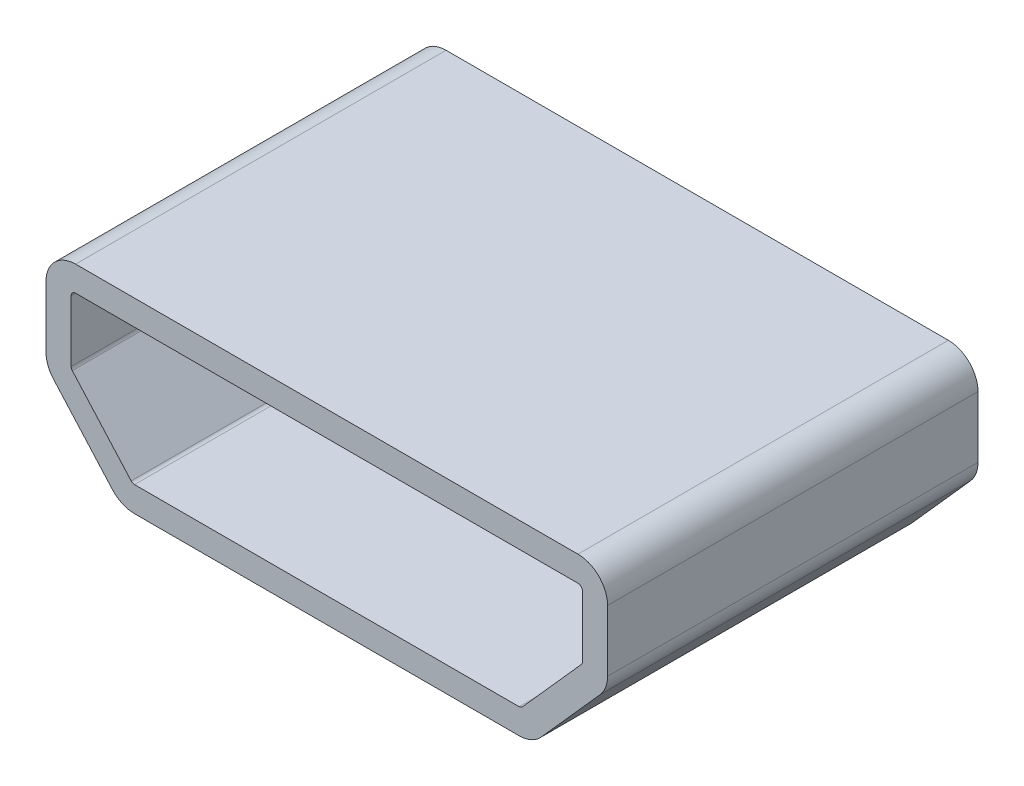
ISO-10303-21;
HEADER;
FILE_DESCRIPTION(('STEP AP214'),'2;1');
FILE_NAME('part.step','',(''),(''),'','','');
FILE_SCHEMA(('AUTOMOTIVE_DESIGN { 1 0 10303 214 1 1 1 1 }'));
ENDSEC;
DATA;
#1=APPLICATION_CONTEXT('core data for automotive mechanical design processes');
#2=APPLICATION_PROTOCOL_DEFINITION('international standard','automotive_design',2000,#1);
#3=PRODUCT_CONTEXT('',#1,'mechanical');
#4=PRODUCT('Part','Part','',(#3));
#5=PRODUCT_RELATED_PRODUCT_CATEGORY('part','',(#4));
#6=PRODUCT_DEFINITION_FORMATION('','',#4);
#7=PRODUCT_DEFINITION_CONTEXT('part definition',#1,'design');
#8=PRODUCT_DEFINITION('design','',#6,#7);
#9=PRODUCT_DEFINITION_SHAPE('','',#8);
#10=(LENGTH_UNIT() NAMED_UNIT(*) SI_UNIT(.MILLI.,.METRE.));
#11=(NAMED_UNIT(*) PLANE_ANGLE_UNIT() SI_UNIT($,.RADIAN.));
#12=(NAMED_UNIT(*) SI_UNIT($,.STERADIAN.) SOLID_ANGLE_UNIT());
#13=UNCERTAINTY_MEASURE_WITH_UNIT(LENGTH_MEASURE(1.E-05),#10,'distance_accuracy_value','');
#14=(GEOMETRIC_REPRESENTATION_CONTEXT(3) GLOBAL_UNCERTAINTY_ASSIGNED_CONTEXT((#13)) GLOBAL_UNIT_ASSIGNED_CONTEXT((#10,
#11,#12)) REPRESENTATION_CONTEXT('',''));
#15=CARTESIAN_POINT('',(0.,0.,0.));
#16=DIRECTION('',(0.,0.,1.));
#17=DIRECTION('',(1.,0.,0.));
#18=AXIS2_PLACEMENT_3D('',#15,#16,#17);
#19=CARTESIAN_POINT('',(3.39,0.0322665726167722,2.5));
#20=DIRECTION('',(0.,0.,-1.));
#21=DIRECTION('',(-1.,0.,0.));
#22=AXIS2_PLACEMENT_3D('',#19,#20,#21);
#23=CYLINDRICAL_SURFACE('',#22,0.0600000000000002);
#24=CARTESIAN_POINT('',(3.39,0.0322665726167722,-2.16));
#25=DIRECTION('',(0.,0.,-1.));
#26=DIRECTION('',(-1.,0.,0.));
#27=AXIS2_PLACEMENT_3D('',#24,#25,#26);
#28=CIRCLE('',#27,0.0600000000000002);
#29=CARTESIAN_POINT('',(3.43481201278046,-0.00763184227109223,-2.16));
#30=VERTEX_POINT('',#29);
#31=CARTESIAN_POINT('',(3.45,0.0322665726167723,-2.16));
#32=VERTEX_POINT('',#31);
#33=EDGE_CURVE('E187',#30,#32,#28,.F.);
#34=ORIENTED_EDGE('',*,*,#33,.F.);
#35=DIRECTION('',(0.,0.,1.));
#36=VECTOR('',#35,1.);
#37=CARTESIAN_POINT('',(3.43481201278046,-0.00763184227109165,2.5));
#38=LINE('',#37,#36);
#39=CARTESIAN_POINT('',(3.43481201278046,-0.00763184227109223,2.5));
#40=VERTEX_POINT('',#39);
#41=EDGE_CURVE('E191',#40,#30,#38,.F.);
#42=ORIENTED_EDGE('',*,*,#41,.F.);
#43=CARTESIAN_POINT('',(3.39,0.0322665726167722,2.5));
#44=DIRECTION('',(0.,0.,-1.));
#45=DIRECTION('',(-1.,0.,0.));
#46=AXIS2_PLACEMENT_3D('',#43,#44,#45);
#47=CIRCLE('',#46,0.0600000000000002);
#48=CARTESIAN_POINT('',(3.45,0.0322665726167723,2.5));
#49=VERTEX_POINT('',#48);
#50=EDGE_CURVE('E20',#49,#40,#47,.T.);
#51=ORIENTED_EDGE('',*,*,#50,.F.);
#52=DIRECTION('',(0.,0.,1.));
#53=VECTOR('',#52,1.);
#54=CARTESIAN_POINT('',(3.45,0.0322665726167723,2.5));
#55=LINE('',#54,#53);
#56=EDGE_CURVE('E201',#32,#49,#55,.T.);
#57=ORIENTED_EDGE('',*,*,#56,.F.);
#58=EDGE_LOOP('',(#34,#42,#51,#57));
#59=FACE_BOUND('',#58,.T.);
#60=ADVANCED_FACE('F17',(#59),#23,.F.);
#61=CARTESIAN_POINT('',(-3.39,0.0322665726167713,2.5));
#62=DIRECTION('',(0.,0.,-1.));
#63=DIRECTION('',(-1.,0.,0.));
#64=AXIS2_PLACEMENT_3D('',#61,#62,#63);
#65=CYLINDRICAL_SURFACE('',#64,0.0600000000000002);
#66=CARTESIAN_POINT('',(-3.39,0.0322665726167713,-2.16));
#67=DIRECTION('',(0.,0.,-1.));
#68=DIRECTION('',(-1.,0.,0.));
#69=AXIS2_PLACEMENT_3D('',#66,#67,#68);
#70=CIRCLE('',#69,0.0600000000000002);
#71=CARTESIAN_POINT('',(-3.45,0.0322665726167713,-2.16));
#72=VERTEX_POINT('',#71);
#73=CARTESIAN_POINT('',(-3.43481201278046,-0.00763184227109303,-2.16));
#74=VERTEX_POINT('',#73);
#75=EDGE_CURVE('E213',#72,#74,#70,.F.);
#76=ORIENTED_EDGE('',*,*,#75,.F.);
#77=DIRECTION('',(0.,0.,-1.));
#78=VECTOR('',#77,1.);
#79=CARTESIAN_POINT('',(-3.45,0.0322665726167714,2.5));
#80=LINE('',#79,#78);
#81=CARTESIAN_POINT('',(-3.45,0.0322665726167713,2.5));
#82=VERTEX_POINT('',#81);
#83=EDGE_CURVE('E209',#82,#72,#80,.T.);
#84=ORIENTED_EDGE('',*,*,#83,.F.);
#85=CARTESIAN_POINT('',(-3.39,0.0322665726167713,2.5));
#86=DIRECTION('',(0.,0.,-1.));
#87=DIRECTION('',(-1.,0.,0.));
#88=AXIS2_PLACEMENT_3D('',#85,#86,#87);
#89=CIRCLE('',#88,0.0600000000000002);
#90=CARTESIAN_POINT('',(-3.43481201278046,-0.00763184227109297,2.5));
#91=VERTEX_POINT('',#90);
#92=EDGE_CURVE('E274',#91,#82,#89,.T.);
#93=ORIENTED_EDGE('',*,*,#92,.F.);
#94=DIRECTION('',(0.,0.,1.));
#95=VECTOR('',#94,1.);
#96=CARTESIAN_POINT('',(-3.43481201278046,-0.00763184227109233,2.5));
#97=LINE('',#96,#95);
#98=EDGE_CURVE('E195',#74,#91,#97,.T.);
#99=ORIENTED_EDGE('',*,*,#98,.F.);
#100=EDGE_LOOP('',(#76,#84,#93,#99));
#101=FACE_BOUND('',#100,.T.);
#102=ADVANCED_FACE('F493',(#101),#65,.F.);
#103=CARTESIAN_POINT('',(-3.45,0.86,2.5));
#104=DIRECTION('',(1.,0.,0.));
#105=DIRECTION('',(0.,0.,-1.));
#106=AXIS2_PLACEMENT_3D('',#103,#104,#105);
#107=PLANE('',#106);
#108=DIRECTION('',(0.,0.,-1.));
#109=VECTOR('',#108,1.);
#110=CARTESIAN_POINT('',(-3.45,0.86,2.5));
#111=LINE('',#110,#109);
#112=CARTESIAN_POINT('',(-3.45,0.86,-2.16));
#113=VERTEX_POINT('',#112);
#114=CARTESIAN_POINT('',(-3.45,0.86,2.5));
#115=VERTEX_POINT('',#114);
#116=EDGE_CURVE('E265',#113,#115,#111,.F.);
#117=ORIENTED_EDGE('',*,*,#116,.T.);
#118=DIRECTION('',(0.,1.,0.));
#119=VECTOR('',#118,1.);
#120=CARTESIAN_POINT('',(-3.45,0.86,2.5));
#121=LINE('',#120,#119);
#122=EDGE_CURVE('E283',#115,#82,#121,.F.);
#123=ORIENTED_EDGE('',*,*,#122,.T.);
#124=ORIENTED_EDGE('',*,*,#83,.T.);
#125=DIRECTION('',(0.,1.,0.));
#126=VECTOR('',#125,1.);
#127=CARTESIAN_POINT('',(-3.45,0.86,-2.16));
#128=LINE('',#127,#126);
#129=EDGE_CURVE('E212',#72,#113,#128,.T.);
#130=ORIENTED_EDGE('',*,*,#129,.T.);
#131=EDGE_LOOP('',(#117,#123,#124,#130));
#132=FACE_BOUND('',#131,.T.);
#133=ADVANCED_FACE('F290',(#132),#107,.T.);
#134=CARTESIAN_POINT('',(3.45,0.86,2.5));
#135=DIRECTION('',(-1.,0.,0.));
#136=DIRECTION('',(0.,0.,1.));
#137=AXIS2_PLACEMENT_3D('',#134,#135,#136);
#138=PLANE('',#137);
#139=ORIENTED_EDGE('',*,*,#56,.T.);
#140=DIRECTION('',(0.,1.,0.));
#141=VECTOR('',#140,1.);
#142=CARTESIAN_POINT('',(3.45,0.86,2.5));
#143=LINE('',#142,#141);
#144=CARTESIAN_POINT('',(3.45,0.86,2.5));
#145=VERTEX_POINT('',#144);
#146=EDGE_CURVE('E186',#49,#145,#143,.T.);
#147=ORIENTED_EDGE('',*,*,#146,.T.);
#148=DIRECTION('',(0.,0.,-1.));
#149=VECTOR('',#148,1.);
#150=CARTESIAN_POINT('',(3.45,0.86,2.5));
#151=LINE('',#150,#149);
#152=CARTESIAN_POINT('',(3.45,0.86,-2.16));
#153=VERTEX_POINT('',#152);
#154=EDGE_CURVE('E262',#145,#153,#151,.T.);
#155=ORIENTED_EDGE('',*,*,#154,.T.);
#156=DIRECTION('',(0.,1.,0.));
#157=VECTOR('',#156,1.);
#158=CARTESIAN_POINT('',(3.45,0.86,-2.16));
#159=LINE('',#158,#157);
#160=EDGE_CURVE('E208',#153,#32,#159,.F.);
#161=ORIENTED_EDGE('',*,*,#160,.T.);
#162=EDGE_LOOP('',(#139,#147,#155,#161));
#163=FACE_BOUND('',#162,.T.);
#164=ADVANCED_FACE('F281',(#163),#138,.T.);
#165=CARTESIAN_POINT('',(3.43481201278046,-0.00763184227109165,2.5));
#166=DIRECTION('',(-0.746866879674295,0.664973581464394,0.));
#167=DIRECTION('',(-0.664973581464394,-0.746866879674295,0.));
#168=AXIS2_PLACEMENT_3D('',#165,#166,#167);
#169=PLANE('',#168);
#170=DIRECTION('',(0.,0.,-1.));
#171=VECTOR('',#170,1.);
#172=CARTESIAN_POINT('',(2.64038168716114,-0.899898414887863,2.5));
#173=LINE('',#172,#171);
#174=CARTESIAN_POINT('',(2.64038168716114,-0.899898414887864,-2.16));
#175=VERTEX_POINT('',#174);
#176=CARTESIAN_POINT('',(2.64038168716114,-0.899898414887864,2.5));
#177=VERTEX_POINT('',#176);
#178=EDGE_CURVE('E194',#175,#177,#173,.F.);
#179=ORIENTED_EDGE('',*,*,#178,.T.);
#180=DIRECTION('',(-0.664973581464394,-0.746866879674295,0.));
#181=VECTOR('',#180,1.);
#182=CARTESIAN_POINT('',(3.43481201278046,-0.00763184227109165,2.5));
#183=LINE('',#182,#181);
#184=EDGE_CURVE('E183',#177,#40,#183,.F.);
#185=ORIENTED_EDGE('',*,*,#184,.T.);
#186=ORIENTED_EDGE('',*,*,#41,.T.);
#187=DIRECTION('',(-0.664973581464394,-0.746866879674295,0.));
#188=VECTOR('',#187,1.);
#189=CARTESIAN_POINT('',(3.43481201278046,-0.00763184227109165,-2.16));
#190=LINE('',#189,#188);
#191=EDGE_CURVE('E196',#30,#175,#190,.T.);
#192=ORIENTED_EDGE('',*,*,#191,.T.);
#193=EDGE_LOOP('',(#179,#185,#186,#192));
#194=FACE_BOUND('',#193,.T.);
#195=ADVANCED_FACE('F190',(#194),#169,.T.);
#196=CARTESIAN_POINT('',(-3.43481201278046,-0.0076318422710923,2.5));
#197=DIRECTION('',(0.746866879674294,0.664973581464394,0.));
#198=DIRECTION('',(-0.664973581464394,0.746866879674294,0.));
#199=AXIS2_PLACEMENT_3D('',#196,#197,#198);
#200=PLANE('',#199);
#201=ORIENTED_EDGE('',*,*,#98,.T.);
#202=DIRECTION('',(-0.664973581464394,0.746866879674294,0.));
#203=VECTOR('',#202,1.);
#204=CARTESIAN_POINT('',(-3.43481201278046,-0.0076318422710923,2.5));
#205=LINE('',#204,#203);
#206=CARTESIAN_POINT('',(-2.64038168716114,-0.899898414887864,2.5));
#207=VERTEX_POINT('',#206);
#208=EDGE_CURVE('E328',#91,#207,#205,.F.);
#209=ORIENTED_EDGE('',*,*,#208,.T.);
#210=DIRECTION('',(0.,0.,-1.));
#211=VECTOR('',#210,1.);
#212=CARTESIAN_POINT('',(-2.64038168716114,-0.899898414887863,2.5));
#213=LINE('',#212,#211);
#214=CARTESIAN_POINT('',(-2.64038168716114,-0.899898414887864,-2.16));
#215=VERTEX_POINT('',#214);
#216=EDGE_CURVE('E246',#207,#215,#213,.T.);
#217=ORIENTED_EDGE('',*,*,#216,.T.);
#218=DIRECTION('',(-0.664973581464394,0.746866879674294,0.));
#219=VECTOR('',#218,1.);
#220=CARTESIAN_POINT('',(-2.64038168716114,-0.899898414887865,-2.16));
#221=LINE('',#220,#219);
#222=EDGE_CURVE('E253',#215,#74,#221,.T.);
#223=ORIENTED_EDGE('',*,*,#222,.T.);
#224=EDGE_LOOP('',(#201,#209,#217,#223));
#225=FACE_BOUND('',#224,.T.);
#226=ADVANCED_FACE('F344',(#225),#200,.T.);
#227=CARTESIAN_POINT('',(-3.68874675186972,-0.233722859968987,2.5));
#228=DIRECTION('',(0.746866879674294,0.664973581464394,0.));
#229=DIRECTION('',(-0.664973581464394,0.746866879674294,0.));
#230=AXIS2_PLACEMENT_3D('',#227,#228,#229);
#231=PLANE('',#230);
#232=DIRECTION('',(0.,0.,-1.));
#233=VECTOR('',#232,1.);
#234=CARTESIAN_POINT('',(-2.8943164262504,-1.12598943258576,2.5));
#235=LINE('',#234,#233);
#236=CARTESIAN_POINT('',(-2.8943164262504,-1.12598943258576,2.5));
#237=VERTEX_POINT('',#236);
#238=CARTESIAN_POINT('',(-2.8943164262504,-1.12598943258576,-2.5));
#239=VERTEX_POINT('',#238);
#240=EDGE_CURVE('E233',#237,#239,#235,.T.);
#241=ORIENTED_EDGE('',*,*,#240,.F.);
#242=DIRECTION('',(-0.664973581464394,0.746866879674294,0.));
#243=VECTOR('',#242,1.);
#244=CARTESIAN_POINT('',(-3.68874675186972,-0.233722859968987,2.5));
#245=LINE('',#244,#243);
#246=CARTESIAN_POINT('',(-3.68874675186972,-0.233722859968987,2.5));
#247=VERTEX_POINT('',#246);
#248=EDGE_CURVE('E325',#247,#237,#245,.F.);
#249=ORIENTED_EDGE('',*,*,#248,.F.);
#250=DIRECTION('',(0.,0.,-1.));
#251=VECTOR('',#250,1.);
#252=CARTESIAN_POINT('',(-3.68874675186972,-0.233722859968986,2.5));
#253=LINE('',#252,#251);
#254=CARTESIAN_POINT('',(-3.68874675186972,-0.233722859968987,-2.5));
#255=VERTEX_POINT('',#254);
#256=EDGE_CURVE('E240',#255,#247,#253,.F.);
#257=ORIENTED_EDGE('',*,*,#256,.F.);
#258=DIRECTION('',(-0.664973581464394,0.746866879674294,0.));
#259=VECTOR('',#258,1.);
#260=CARTESIAN_POINT('',(-3.68874675186972,-0.233722859968987,-2.5));
#261=LINE('',#260,#259);
#262=EDGE_CURVE('E322',#239,#255,#261,.T.);
#263=ORIENTED_EDGE('',*,*,#262,.F.);
#264=EDGE_LOOP('',(#241,#249,#257,#263));
#265=FACE_BOUND('',#264,.T.);
#266=ADVANCED_FACE('F481',(#265),#231,.F.);
#267=CARTESIAN_POINT('',(3.68874675186972,-0.233722859968986,2.5));
#268=DIRECTION('',(-0.746866879674295,0.664973581464394,0.));
#269=DIRECTION('',(-0.664973581464394,-0.746866879674295,0.));
#270=AXIS2_PLACEMENT_3D('',#267,#268,#269);
#271=PLANE('',#270);
#272=DIRECTION('',(0.,0.,-1.));
#273=VECTOR('',#272,1.);
#274=CARTESIAN_POINT('',(3.68874675186972,-0.233722859968985,2.5));
#275=LINE('',#274,#273);
#276=CARTESIAN_POINT('',(3.68874675186972,-0.233722859968986,2.5));
#277=VERTEX_POINT('',#276);
#278=CARTESIAN_POINT('',(3.68874675186972,-0.233722859968986,-2.5));
#279=VERTEX_POINT('',#278);
#280=EDGE_CURVE('E205',#277,#279,#275,.T.);
#281=ORIENTED_EDGE('',*,*,#280,.F.);
#282=DIRECTION('',(-0.664973581464394,-0.746866879674295,0.));
#283=VECTOR('',#282,1.);
#284=CARTESIAN_POINT('',(3.68874675186972,-0.233722859968986,2.5));
#285=LINE('',#284,#283);
#286=CARTESIAN_POINT('',(2.8943164262504,-1.12598943258576,2.5));
#287=VERTEX_POINT('',#286);
#288=EDGE_CURVE('E319',#287,#277,#285,.F.);
#289=ORIENTED_EDGE('',*,*,#288,.F.);
#290=DIRECTION('',(0.,0.,-1.));
#291=VECTOR('',#290,1.);
#292=CARTESIAN_POINT('',(2.8943164262504,-1.12598943258576,2.5));
#293=LINE('',#292,#291);
#294=CARTESIAN_POINT('',(2.8943164262504,-1.12598943258576,-2.5));
#295=VERTEX_POINT('',#294);
#296=EDGE_CURVE('E230',#295,#287,#293,.F.);
#297=ORIENTED_EDGE('',*,*,#296,.F.);
#298=DIRECTION('',(-0.664973581464394,-0.746866879674295,0.));
#299=VECTOR('',#298,1.);
#300=CARTESIAN_POINT('',(3.68874675186972,-0.233722859968986,-2.5));
#301=LINE('',#300,#299);
#302=EDGE_CURVE('E272',#279,#295,#301,.T.);
#303=ORIENTED_EDGE('',*,*,#302,.F.);
#304=EDGE_LOOP('',(#281,#289,#297,#303));
#305=FACE_BOUND('',#304,.T.);
#306=ADVANCED_FACE('F477',(#305),#271,.F.);
#307=CARTESIAN_POINT('',(3.39,0.0322665726167722,2.5));
#308=DIRECTION('',(0.,0.,-1.));
#309=DIRECTION('',(-1.,0.,0.));
#310=AXIS2_PLACEMENT_3D('',#307,#308,#309);
#311=CYLINDRICAL_SURFACE('',#310,0.4);
#312=CARTESIAN_POINT('',(3.39,0.0322665726167722,2.5));
#313=DIRECTION('',(0.,0.,-1.));
#314=DIRECTION('',(-1.,0.,0.));
#315=AXIS2_PLACEMENT_3D('',#312,#313,#314);
#316=CIRCLE('',#315,0.4);
#317=CARTESIAN_POINT('',(3.79,0.0322665726167722,2.5));
#318=VERTEX_POINT('',#317);
#319=EDGE_CURVE('E268',#318,#277,#316,.T.);
#320=ORIENTED_EDGE('',*,*,#319,.T.);
#321=ORIENTED_EDGE('',*,*,#280,.T.);
#322=CARTESIAN_POINT('',(3.39,0.0322665726167722,-2.5));
#323=DIRECTION('',(0.,0.,-1.));
#324=DIRECTION('',(-1.,0.,0.));
#325=AXIS2_PLACEMENT_3D('',#322,#323,#324);
#326=CIRCLE('',#325,0.4);
#327=CARTESIAN_POINT('',(3.79,0.0322665726167722,-2.5));
#328=VERTEX_POINT('',#327);
#329=EDGE_CURVE('E270',#279,#328,#326,.F.);
#330=ORIENTED_EDGE('',*,*,#329,.T.);
#331=DIRECTION('',(0.,0.,1.));
#332=VECTOR('',#331,1.);
#333=CARTESIAN_POINT('',(3.79,0.0322665726167723,2.5));
#334=LINE('',#333,#332);
#335=EDGE_CURVE('E229',#328,#318,#334,.T.);
#336=ORIENTED_EDGE('',*,*,#335,.T.);
#337=EDGE_LOOP('',(#320,#321,#330,#336));
#338=FACE_BOUND('',#337,.T.);
#339=ADVANCED_FACE('F474',(#338),#311,.T.);
#340=CARTESIAN_POINT('',(-3.39,0.86,2.5));
#341=DIRECTION('',(0.,0.,-1.));
#342=DIRECTION('',(-1.,0.,0.));
#343=AXIS2_PLACEMENT_3D('',#340,#341,#342);
#344=CYLINDRICAL_SURFACE('',#343,0.0600000000000002);
#345=CARTESIAN_POINT('',(-3.39,0.86,-2.16));
#346=DIRECTION('',(0.,0.,-1.));
#347=DIRECTION('',(-1.,0.,0.));
#348=AXIS2_PLACEMENT_3D('',#345,#346,#347);
#349=CIRCLE('',#348,0.0600000000000002);
#350=CARTESIAN_POINT('',(-3.39,0.92,-2.16));
#351=VERTEX_POINT('',#350);
#352=EDGE_CURVE('E250',#113,#351,#349,.T.);
#353=ORIENTED_EDGE('',*,*,#352,.T.);
#354=DIRECTION('',(0.,0.,1.));
#355=VECTOR('',#354,1.);
#356=CARTESIAN_POINT('',(-3.39,0.92,2.5));
#357=LINE('',#356,#355);
#358=CARTESIAN_POINT('',(-3.39,0.92,2.5));
#359=VERTEX_POINT('',#358);
#360=EDGE_CURVE('E305',#359,#351,#357,.F.);
#361=ORIENTED_EDGE('',*,*,#360,.F.);
#362=CARTESIAN_POINT('',(-3.39,0.86,2.5));
#363=DIRECTION('',(0.,0.,-1.));
#364=DIRECTION('',(-1.,0.,0.));
#365=AXIS2_PLACEMENT_3D('',#362,#363,#364);
#366=CIRCLE('',#365,0.0600000000000002);
#367=EDGE_CURVE('E266',#115,#359,#366,.T.);
#368=ORIENTED_EDGE('',*,*,#367,.F.);
#369=ORIENTED_EDGE('',*,*,#116,.F.);
#370=EDGE_LOOP('',(#353,#361,#368,#369));
#371=FACE_BOUND('',#370,.T.);
#372=ADVANCED_FACE('F294',(#371),#344,.F.);
#373=CARTESIAN_POINT('',(3.39,0.86,2.5));
#374=DIRECTION('',(0.,0.,-1.));
#375=DIRECTION('',(-1.,0.,0.));
#376=AXIS2_PLACEMENT_3D('',#373,#374,#375);
#377=CYLINDRICAL_SURFACE('',#376,0.0600000000000002);
#378=CARTESIAN_POINT('',(3.39,0.86,-2.16));
#379=DIRECTION('',(0.,0.,-1.));
#380=DIRECTION('',(-1.,0.,0.));
#381=AXIS2_PLACEMENT_3D('',#378,#379,#380);
#382=CIRCLE('',#381,0.0600000000000002);
#383=CARTESIAN_POINT('',(3.39,0.920000000000001,-2.16));
#384=VERTEX_POINT('',#383);
#385=EDGE_CURVE('E257',#384,#153,#382,.T.);
#386=ORIENTED_EDGE('',*,*,#385,.T.);
#387=ORIENTED_EDGE('',*,*,#154,.F.);
#388=CARTESIAN_POINT('',(3.39,0.86,2.5));
#389=DIRECTION('',(0.,0.,-1.));
#390=DIRECTION('',(-1.,0.,0.));
#391=AXIS2_PLACEMENT_3D('',#388,#389,#390);
#392=CIRCLE('',#391,0.0600000000000002);
#393=CARTESIAN_POINT('',(3.39,0.92,2.5));
#394=VERTEX_POINT('',#393);
#395=EDGE_CURVE('E263',#394,#145,#392,.T.);
#396=ORIENTED_EDGE('',*,*,#395,.F.);
#397=DIRECTION('',(0.,0.,1.));
#398=VECTOR('',#397,1.);
#399=CARTESIAN_POINT('',(3.39,0.920000000000001,2.5));
#400=LINE('',#399,#398);
#401=EDGE_CURVE('E304',#384,#394,#400,.T.);
#402=ORIENTED_EDGE('',*,*,#401,.F.);
#403=EDGE_LOOP('',(#386,#387,#396,#402));
#404=FACE_BOUND('',#403,.T.);
#405=ADVANCED_FACE('F467',(#404),#377,.F.);
#406=CARTESIAN_POINT('',(2.59556967438068,-0.86,2.5));
#407=DIRECTION('',(0.,0.,-1.));
#408=DIRECTION('',(-1.,0.,0.));
#409=AXIS2_PLACEMENT_3D('',#406,#407,#408);
#410=CYLINDRICAL_SURFACE('',#409,0.0600000000000002);
#411=CARTESIAN_POINT('',(2.59556967438068,-0.86,-2.16));
#412=DIRECTION('',(0.,0.,-1.));
#413=DIRECTION('',(-1.,0.,0.));
#414=AXIS2_PLACEMENT_3D('',#411,#412,#413);
#415=CIRCLE('',#414,0.0600000000000002);
#416=CARTESIAN_POINT('',(2.59556967438068,-0.92,-2.16));
#417=VERTEX_POINT('',#416);
#418=EDGE_CURVE('E254',#175,#417,#415,.T.);
#419=ORIENTED_EDGE('',*,*,#418,.T.);
#420=DIRECTION('',(0.,0.,1.));
#421=VECTOR('',#420,1.);
#422=CARTESIAN_POINT('',(2.59556967438068,-0.92,2.5));
#423=LINE('',#422,#421);
#424=CARTESIAN_POINT('',(2.59556967438068,-0.92,2.5));
#425=VERTEX_POINT('',#424);
#426=EDGE_CURVE('E307',#425,#417,#423,.F.);
#427=ORIENTED_EDGE('',*,*,#426,.F.);
#428=CARTESIAN_POINT('',(2.59556967438068,-0.86,2.5));
#429=DIRECTION('',(0.,0.,-1.));
#430=DIRECTION('',(-1.,0.,0.));
#431=AXIS2_PLACEMENT_3D('',#428,#429,#430);
#432=CIRCLE('',#431,0.0600000000000002);
#433=EDGE_CURVE('E260',#177,#425,#432,.T.);
#434=ORIENTED_EDGE('',*,*,#433,.F.);
#435=ORIENTED_EDGE('',*,*,#178,.F.);
#436=EDGE_LOOP('',(#419,#427,#434,#435));
#437=FACE_BOUND('',#436,.T.);
#438=ADVANCED_FACE('F464',(#437),#410,.F.);
#439=CARTESIAN_POINT('',(-2.59556967438068,-0.86,-2.16));
#440=DIRECTION('',(0.,0.,-1.));
#441=DIRECTION('',(-1.,0.,0.));
#442=AXIS2_PLACEMENT_3D('',#439,#440,#441);
#443=PLANE('',#442);
#444=ORIENTED_EDGE('',*,*,#129,.F.);
#445=ORIENTED_EDGE('',*,*,#75,.T.);
#446=ORIENTED_EDGE('',*,*,#222,.F.);
#447=CARTESIAN_POINT('',(-2.59556967438068,-0.86,-2.16));
#448=DIRECTION('',(0.,0.,-1.));
#449=DIRECTION('',(-1.,0.,0.));
#450=AXIS2_PLACEMENT_3D('',#447,#448,#449);
#451=CIRCLE('',#450,0.0600000000000002);
#452=CARTESIAN_POINT('',(-2.59556967438068,-0.92,-2.16));
#453=VERTEX_POINT('',#452);
#454=EDGE_CURVE('E243',#215,#453,#451,.F.);
#455=ORIENTED_EDGE('',*,*,#454,.T.);
#456=DIRECTION('',(1.,0.,0.));
#457=VECTOR('',#456,1.);
#458=CARTESIAN_POINT('',(-2.59556967438068,-0.92,-2.16));
#459=LINE('',#458,#457);
#460=EDGE_CURVE('E359',#417,#453,#459,.F.);
#461=ORIENTED_EDGE('',*,*,#460,.F.);
#462=ORIENTED_EDGE('',*,*,#418,.F.);
#463=ORIENTED_EDGE('',*,*,#191,.F.);
#464=ORIENTED_EDGE('',*,*,#33,.T.);
#465=ORIENTED_EDGE('',*,*,#160,.F.);
#466=ORIENTED_EDGE('',*,*,#385,.F.);
#467=DIRECTION('',(1.,0.,0.));
#468=VECTOR('',#467,1.);
#469=CARTESIAN_POINT('',(-3.39,0.92,-2.16));
#470=LINE('',#469,#468);
#471=EDGE_CURVE('E300',#351,#384,#470,.T.);
#472=ORIENTED_EDGE('',*,*,#471,.F.);
#473=ORIENTED_EDGE('',*,*,#352,.F.);
#474=EDGE_LOOP('',(#444,#445,#446,#455,#461,#462,#463,#464,#465,#466,#472,#473));
#475=FACE_BOUND('',#474,.T.);
#476=ADVANCED_FACE('F277',(#475),#443,.F.);
#477=CARTESIAN_POINT('',(-2.59556967438068,-0.86,2.5));
#478=DIRECTION('',(0.,0.,-1.));
#479=DIRECTION('',(-1.,0.,0.));
#480=AXIS2_PLACEMENT_3D('',#477,#478,#479);
#481=CYLINDRICAL_SURFACE('',#480,0.0600000000000002);
#482=ORIENTED_EDGE('',*,*,#454,.F.);
#483=ORIENTED_EDGE('',*,*,#216,.F.);
#484=CARTESIAN_POINT('',(-2.59556967438068,-0.86,2.5));
#485=DIRECTION('',(0.,0.,-1.));
#486=DIRECTION('',(-1.,0.,0.));
#487=AXIS2_PLACEMENT_3D('',#484,#485,#486);
#488=CIRCLE('',#487,0.0600000000000002);
#489=CARTESIAN_POINT('',(-2.59556967438068,-0.92,2.5));
#490=VERTEX_POINT('',#489);
#491=EDGE_CURVE('E247',#490,#207,#488,.T.);
#492=ORIENTED_EDGE('',*,*,#491,.F.);
#493=DIRECTION('',(0.,0.,1.));
#494=VECTOR('',#493,1.);
#495=CARTESIAN_POINT('',(-2.59556967438068,-0.92,2.5));
#496=LINE('',#495,#494);
#497=EDGE_CURVE('E355',#453,#490,#496,.T.);
#498=ORIENTED_EDGE('',*,*,#497,.F.);
#499=EDGE_LOOP('',(#482,#483,#492,#498));
#500=FACE_BOUND('',#499,.T.);
#501=ADVANCED_FACE('F354',(#500),#481,.F.);
#502=CARTESIAN_POINT('',(-3.39,0.0322665726167713,2.5));
#503=DIRECTION('',(0.,0.,-1.));
#504=DIRECTION('',(-1.,0.,0.));
#505=AXIS2_PLACEMENT_3D('',#502,#503,#504);
#506=CYLINDRICAL_SURFACE('',#505,0.4);
#507=CARTESIAN_POINT('',(-3.39,0.0322665726167713,2.5));
#508=DIRECTION('',(0.,0.,-1.));
#509=DIRECTION('',(-1.,0.,0.));
#510=AXIS2_PLACEMENT_3D('',#507,#508,#509);
#511=CIRCLE('',#510,0.4);
#512=CARTESIAN_POINT('',(-3.79,0.0322665726167713,2.5));
#513=VERTEX_POINT('',#512);
#514=EDGE_CURVE('E238',#247,#513,#511,.T.);
#515=ORIENTED_EDGE('',*,*,#514,.T.);
#516=DIRECTION('',(0.,0.,1.));
#517=VECTOR('',#516,1.);
#518=CARTESIAN_POINT('',(-3.79,0.0322665726167714,2.5));
#519=LINE('',#518,#517);
#520=CARTESIAN_POINT('',(-3.79,0.0322665726167712,-2.5));
#521=VERTEX_POINT('',#520);
#522=EDGE_CURVE('E360',#513,#521,#519,.F.);
#523=ORIENTED_EDGE('',*,*,#522,.T.);
#524=CARTESIAN_POINT('',(-3.39,0.0322665726167713,-2.5));
#525=DIRECTION('',(0.,0.,-1.));
#526=DIRECTION('',(-1.,0.,0.));
#527=AXIS2_PLACEMENT_3D('',#524,#525,#526);
#528=CIRCLE('',#527,0.4);
#529=EDGE_CURVE('E241',#521,#255,#528,.F.);
#530=ORIENTED_EDGE('',*,*,#529,.T.);
#531=ORIENTED_EDGE('',*,*,#256,.T.);
#532=EDGE_LOOP('',(#515,#523,#530,#531));
#533=FACE_BOUND('',#532,.T.);
#534=ADVANCED_FACE('F455',(#533),#506,.T.);
#535=CARTESIAN_POINT('',(-2.59556967438068,-0.86,2.5));
#536=DIRECTION('',(0.,0.,-1.));
#537=DIRECTION('',(-1.,0.,0.));
#538=AXIS2_PLACEMENT_3D('',#535,#536,#537);
#539=CYLINDRICAL_SURFACE('',#538,0.4);
#540=CARTESIAN_POINT('',(-2.59556967438068,-0.86,2.5));
#541=DIRECTION('',(0.,0.,-1.));
#542=DIRECTION('',(-1.,0.,0.));
#543=AXIS2_PLACEMENT_3D('',#540,#541,#542);
#544=CIRCLE('',#543,0.4);
#545=CARTESIAN_POINT('',(-2.59556967438068,-1.26,2.5));
#546=VERTEX_POINT('',#545);
#547=EDGE_CURVE('E234',#546,#237,#544,.T.);
#548=ORIENTED_EDGE('',*,*,#547,.T.);
#549=ORIENTED_EDGE('',*,*,#240,.T.);
#550=CARTESIAN_POINT('',(-2.59556967438068,-0.86,-2.5));
#551=DIRECTION('',(0.,0.,-1.));
#552=DIRECTION('',(-1.,0.,0.));
#553=AXIS2_PLACEMENT_3D('',#550,#551,#552);
#554=CIRCLE('',#553,0.4);
#555=CARTESIAN_POINT('',(-2.59556967438068,-1.26,-2.5));
#556=VERTEX_POINT('',#555);
#557=EDGE_CURVE('E236',#239,#556,#554,.F.);
#558=ORIENTED_EDGE('',*,*,#557,.T.);
#559=DIRECTION('',(0.,0.,1.));
#560=VECTOR('',#559,1.);
#561=CARTESIAN_POINT('',(-2.59556967438068,-1.26,2.5));
#562=LINE('',#561,#560);
#563=EDGE_CURVE('E389',#556,#546,#562,.T.);
#564=ORIENTED_EDGE('',*,*,#563,.T.);
#565=EDGE_LOOP('',(#548,#549,#558,#564));
#566=FACE_BOUND('',#565,.T.);
#567=ADVANCED_FACE('F451',(#566),#539,.T.);
#568=CARTESIAN_POINT('',(2.59556967438068,-0.86,2.5));
#569=DIRECTION('',(0.,0.,-1.));
#570=DIRECTION('',(-1.,0.,0.));
#571=AXIS2_PLACEMENT_3D('',#568,#569,#570);
#572=CYLINDRICAL_SURFACE('',#571,0.4);
#573=CARTESIAN_POINT('',(2.59556967438068,-0.86,2.5));
#574=DIRECTION('',(0.,0.,-1.));
#575=DIRECTION('',(-1.,0.,0.));
#576=AXIS2_PLACEMENT_3D('',#573,#574,#575);
#577=CIRCLE('',#576,0.4);
#578=CARTESIAN_POINT('',(2.59556967438068,-1.26,2.5));
#579=VERTEX_POINT('',#578);
#580=EDGE_CURVE('E227',#287,#579,#577,.T.);
#581=ORIENTED_EDGE('',*,*,#580,.T.);
#582=DIRECTION('',(0.,0.,1.));
#583=VECTOR('',#582,1.);
#584=CARTESIAN_POINT('',(2.59556967438068,-1.26,2.5));
#585=LINE('',#584,#583);
#586=CARTESIAN_POINT('',(2.59556967438068,-1.26,-2.5));
#587=VERTEX_POINT('',#586);
#588=EDGE_CURVE('E384',#579,#587,#585,.F.);
#589=ORIENTED_EDGE('',*,*,#588,.T.);
#590=CARTESIAN_POINT('',(2.59556967438068,-0.86,-2.5));
#591=DIRECTION('',(0.,0.,-1.));
#592=DIRECTION('',(-1.,0.,0.));
#593=AXIS2_PLACEMENT_3D('',#590,#591,#592);
#594=CIRCLE('',#593,0.4);
#595=EDGE_CURVE('E231',#587,#295,#594,.F.);
#596=ORIENTED_EDGE('',*,*,#595,.T.);
#597=ORIENTED_EDGE('',*,*,#296,.T.);
#598=EDGE_LOOP('',(#581,#589,#596,#597));
#599=FACE_BOUND('',#598,.T.);
#600=ADVANCED_FACE('F448',(#599),#572,.T.);
#601=CARTESIAN_POINT('',(3.79,0.86,2.5));
#602=DIRECTION('',(-1.,0.,0.));
#603=DIRECTION('',(0.,-1.,0.));
#604=AXIS2_PLACEMENT_3D('',#601,#602,#603);
#605=PLANE('',#604);
#606=DIRECTION('',(0.,0.,-1.));
#607=VECTOR('',#606,1.);
#608=CARTESIAN_POINT('',(3.79,0.86,2.5));
#609=LINE('',#608,#607);
#610=CARTESIAN_POINT('',(3.79,0.86,2.5));
#611=VERTEX_POINT('',#610);
#612=CARTESIAN_POINT('',(3.79,0.86,-2.5));
#613=VERTEX_POINT('',#612);
#614=EDGE_CURVE('E379',#611,#613,#609,.T.);
#615=ORIENTED_EDGE('',*,*,#614,.F.);
#616=DIRECTION('',(0.,-1.,0.));
#617=VECTOR('',#616,1.);
#618=CARTESIAN_POINT('',(3.79,0.86,2.5));
#619=LINE('',#618,#617);
#620=EDGE_CURVE('E316',#318,#611,#619,.F.);
#621=ORIENTED_EDGE('',*,*,#620,.F.);
#622=ORIENTED_EDGE('',*,*,#335,.F.);
#623=DIRECTION('',(0.,-1.,0.));
#624=VECTOR('',#623,1.);
#625=CARTESIAN_POINT('',(3.79,0.86,-2.5));
#626=LINE('',#625,#624);
#627=EDGE_CURVE('E309',#613,#328,#626,.T.);
#628=ORIENTED_EDGE('',*,*,#627,.F.);
#629=EDGE_LOOP('',(#615,#621,#622,#628));
#630=FACE_BOUND('',#629,.T.);
#631=ADVANCED_FACE('F377',(#630),#605,.F.);
#632=CARTESIAN_POINT('',(-3.39,0.92,2.5));
#633=DIRECTION('',(0.,-1.,0.));
#634=DIRECTION('',(1.,0.,0.));
#635=AXIS2_PLACEMENT_3D('',#632,#633,#634);
#636=PLANE('',#635);
#637=ORIENTED_EDGE('',*,*,#401,.T.);
#638=DIRECTION('',(1.,0.,0.));
#639=VECTOR('',#638,1.);
#640=CARTESIAN_POINT('',(-2.59556967438068,0.92,2.5));
#641=LINE('',#640,#639);
#642=EDGE_CURVE('E416',#359,#394,#641,.T.);
#643=ORIENTED_EDGE('',*,*,#642,.F.);
#644=ORIENTED_EDGE('',*,*,#360,.T.);
#645=ORIENTED_EDGE('',*,*,#471,.T.);
#646=EDGE_LOOP('',(#637,#643,#644,#645));
#647=FACE_BOUND('',#646,.T.);
#648=ADVANCED_FACE('F443',(#647),#636,.T.);
#649=CARTESIAN_POINT('',(-2.59556967438068,-0.92,2.5));
#650=DIRECTION('',(0.,1.,0.));
#651=DIRECTION('',(0.,0.,1.));
#652=AXIS2_PLACEMENT_3D('',#649,#650,#651);
#653=PLANE('',#652);
#654=ORIENTED_EDGE('',*,*,#497,.T.);
#655=DIRECTION('',(1.,0.,0.));
#656=VECTOR('',#655,1.);
#657=CARTESIAN_POINT('',(-2.59556967438068,-0.92,2.5));
#658=LINE('',#657,#656);
#659=EDGE_CURVE('E349',#425,#490,#658,.F.);
#660=ORIENTED_EDGE('',*,*,#659,.F.);
#661=ORIENTED_EDGE('',*,*,#426,.T.);
#662=ORIENTED_EDGE('',*,*,#460,.T.);
#663=EDGE_LOOP('',(#654,#660,#661,#662));
#664=FACE_BOUND('',#663,.T.);
#665=ADVANCED_FACE('F357',(#664),#653,.T.);
#666=CARTESIAN_POINT('',(-3.79,0.86,2.5));
#667=DIRECTION('',(1.,0.,0.));
#668=DIRECTION('',(0.,1.,0.));
#669=AXIS2_PLACEMENT_3D('',#666,#667,#668);
#670=PLANE('',#669);
#671=ORIENTED_EDGE('',*,*,#522,.F.);
#672=DIRECTION('',(0.,1.,0.));
#673=VECTOR('',#672,1.);
#674=CARTESIAN_POINT('',(-3.79,-0.86,2.5));
#675=LINE('',#674,#673);
#676=CARTESIAN_POINT('',(-3.79,0.86,2.5));
#677=VERTEX_POINT('',#676);
#678=EDGE_CURVE('E225',#677,#513,#675,.F.);
#679=ORIENTED_EDGE('',*,*,#678,.F.);
#680=DIRECTION('',(0.,0.,-1.));
#681=VECTOR('',#680,1.);
#682=CARTESIAN_POINT('',(-3.79,0.86,2.5));
#683=LINE('',#682,#681);
#684=CARTESIAN_POINT('',(-3.79,0.86,-2.5));
#685=VERTEX_POINT('',#684);
#686=EDGE_CURVE('E222',#685,#677,#683,.F.);
#687=ORIENTED_EDGE('',*,*,#686,.F.);
#688=DIRECTION('',(0.,1.,0.));
#689=VECTOR('',#688,1.);
#690=CARTESIAN_POINT('',(-3.79,0.86,-2.5));
#691=LINE('',#690,#689);
#692=EDGE_CURVE('E363',#521,#685,#691,.T.);
#693=ORIENTED_EDGE('',*,*,#692,.F.);
#694=EDGE_LOOP('',(#671,#679,#687,#693));
#695=FACE_BOUND('',#694,.T.);
#696=ADVANCED_FACE('F399',(#695),#670,.F.);
#697=CARTESIAN_POINT('',(-2.59556967438068,-1.26,2.5));
#698=DIRECTION('',(0.,1.,0.));
#699=DIRECTION('',(-1.,0.,0.));
#700=AXIS2_PLACEMENT_3D('',#697,#698,#699);
#701=PLANE('',#700);
#702=ORIENTED_EDGE('',*,*,#588,.F.);
#703=DIRECTION('',(1.,0.,0.));
#704=VECTOR('',#703,1.);
#705=CARTESIAN_POINT('',(-2.59556967438068,-1.26,2.5));
#706=LINE('',#705,#704);
#707=EDGE_CURVE('E226',#546,#579,#706,.T.);
#708=ORIENTED_EDGE('',*,*,#707,.F.);
#709=ORIENTED_EDGE('',*,*,#563,.F.);
#710=DIRECTION('',(1.,0.,0.));
#711=VECTOR('',#710,1.);
#712=CARTESIAN_POINT('',(-2.59556967438068,-1.26,-2.5));
#713=LINE('',#712,#711);
#714=EDGE_CURVE('E219',#556,#587,#713,.T.);
#715=ORIENTED_EDGE('',*,*,#714,.T.);
#716=EDGE_LOOP('',(#702,#708,#709,#715));
#717=FACE_BOUND('',#716,.T.);
#718=ADVANCED_FACE('F435',(#717),#701,.F.);
#719=CARTESIAN_POINT('',(3.39,0.86,2.5));
#720=DIRECTION('',(0.,0.,-1.));
#721=DIRECTION('',(-1.,0.,0.));
#722=AXIS2_PLACEMENT_3D('',#719,#720,#721);
#723=CYLINDRICAL_SURFACE('',#722,0.4);
#724=CARTESIAN_POINT('',(3.39,0.86,2.5));
#725=DIRECTION('',(0.,0.,-1.));
#726=DIRECTION('',(-1.,0.,0.));
#727=AXIS2_PLACEMENT_3D('',#724,#725,#726);
#728=CIRCLE('',#727,0.4);
#729=CARTESIAN_POINT('',(3.39,1.26,2.5));
#730=VERTEX_POINT('',#729);
#731=EDGE_CURVE('E223',#611,#730,#728,.F.);
#732=ORIENTED_EDGE('',*,*,#731,.F.);
#733=ORIENTED_EDGE('',*,*,#614,.T.);
#734=CARTESIAN_POINT('',(3.39,0.86,-2.5));
#735=DIRECTION('',(0.,0.,-1.));
#736=DIRECTION('',(-1.,0.,0.));
#737=AXIS2_PLACEMENT_3D('',#734,#735,#736);
#738=CIRCLE('',#737,0.4);
#739=CARTESIAN_POINT('',(3.39,1.26,-2.5));
#740=VERTEX_POINT('',#739);
#741=EDGE_CURVE('E216',#613,#740,#738,.F.);
#742=ORIENTED_EDGE('',*,*,#741,.T.);
#743=DIRECTION('',(0.,0.,1.));
#744=VECTOR('',#743,1.);
#745=CARTESIAN_POINT('',(3.39,1.26,2.5));
#746=LINE('',#745,#744);
#747=EDGE_CURVE('E215',#740,#730,#746,.T.);
#748=ORIENTED_EDGE('',*,*,#747,.T.);
#749=EDGE_LOOP('',(#732,#733,#742,#748));
#750=FACE_BOUND('',#749,.T.);
#751=ADVANCED_FACE('F382',(#750),#723,.T.);
#752=CARTESIAN_POINT('',(-2.59556967438068,-0.86,2.5));
#753=DIRECTION('',(0.,0.,1.));
#754=DIRECTION('',(1.,0.,0.));
#755=AXIS2_PLACEMENT_3D('',#752,#753,#754);
#756=PLANE('',#755);
#757=ORIENTED_EDGE('',*,*,#208,.F.);
#758=ORIENTED_EDGE('',*,*,#92,.T.);
#759=ORIENTED_EDGE('',*,*,#122,.F.);
#760=ORIENTED_EDGE('',*,*,#367,.T.);
#761=ORIENTED_EDGE('',*,*,#642,.T.);
#762=ORIENTED_EDGE('',*,*,#395,.T.);
#763=ORIENTED_EDGE('',*,*,#146,.F.);
#764=ORIENTED_EDGE('',*,*,#50,.T.);
#765=ORIENTED_EDGE('',*,*,#184,.F.);
#766=ORIENTED_EDGE('',*,*,#433,.T.);
#767=ORIENTED_EDGE('',*,*,#659,.T.);
#768=ORIENTED_EDGE('',*,*,#491,.T.);
#769=EDGE_LOOP('',(#757,#758,#759,#760,#761,#762,#763,#764,#765,#766,#767,#768));
#770=FACE_BOUND('',#769,.T.);
#771=ORIENTED_EDGE('',*,*,#514,.F.);
#772=ORIENTED_EDGE('',*,*,#248,.T.);
#773=ORIENTED_EDGE('',*,*,#547,.F.);
#774=ORIENTED_EDGE('',*,*,#707,.T.);
#775=ORIENTED_EDGE('',*,*,#580,.F.);
#776=ORIENTED_EDGE('',*,*,#288,.T.);
#777=ORIENTED_EDGE('',*,*,#319,.F.);
#778=ORIENTED_EDGE('',*,*,#620,.T.);
#779=ORIENTED_EDGE('',*,*,#731,.T.);
#780=DIRECTION('',(1.,0.,0.));
#781=VECTOR('',#780,1.);
#782=CARTESIAN_POINT('',(-3.39,1.26,2.5));
#783=LINE('',#782,#781);
#784=CARTESIAN_POINT('',(-3.39,1.26,2.5));
#785=VERTEX_POINT('',#784);
#786=EDGE_CURVE('E409',#730,#785,#783,.F.);
#787=ORIENTED_EDGE('',*,*,#786,.T.);
#788=CARTESIAN_POINT('',(-3.39,0.86,2.5));
#789=DIRECTION('',(0.,0.,-1.));
#790=DIRECTION('',(-1.,0.,0.));
#791=AXIS2_PLACEMENT_3D('',#788,#789,#790);
#792=CIRCLE('',#791,0.4);
#793=EDGE_CURVE('E220',#677,#785,#792,.T.);
#794=ORIENTED_EDGE('',*,*,#793,.F.);
#795=ORIENTED_EDGE('',*,*,#678,.T.);
#796=EDGE_LOOP('',(#771,#772,#773,#774,#775,#776,#777,#778,#779,#787,#794,#795));
#797=FACE_BOUND('',#796,.T.);
#798=ADVANCED_FACE('F181',(#770,#797),#756,.T.);
#799=CARTESIAN_POINT('',(-3.39,0.86,2.5));
#800=DIRECTION('',(0.,0.,-1.));
#801=DIRECTION('',(-1.,0.,0.));
#802=AXIS2_PLACEMENT_3D('',#799,#800,#801);
#803=CYLINDRICAL_SURFACE('',#802,0.4);
#804=ORIENTED_EDGE('',*,*,#793,.T.);
#805=DIRECTION('',(0.,0.,1.));
#806=VECTOR('',#805,1.);
#807=CARTESIAN_POINT('',(-3.39,1.26,2.5));
#808=LINE('',#807,#806);
#809=CARTESIAN_POINT('',(-3.39,1.26,-2.5));
#810=VERTEX_POINT('',#809);
#811=EDGE_CURVE('E26',#785,#810,#808,.F.);
#812=ORIENTED_EDGE('',*,*,#811,.T.);
#813=CARTESIAN_POINT('',(-3.39,0.86,-2.5));
#814=DIRECTION('',(0.,0.,-1.));
#815=DIRECTION('',(-1.,0.,0.));
#816=AXIS2_PLACEMENT_3D('',#813,#814,#815);
#817=CIRCLE('',#816,0.4);
#818=EDGE_CURVE('E34',#810,#685,#817,.F.);
#819=ORIENTED_EDGE('',*,*,#818,.T.);
#820=ORIENTED_EDGE('',*,*,#686,.T.);
#821=EDGE_LOOP('',(#804,#812,#819,#820));
#822=FACE_BOUND('',#821,.T.);
#823=ADVANCED_FACE('F404',(#822),#803,.T.);
#824=CARTESIAN_POINT('',(-2.59556967438068,-0.86,-2.5));
#825=DIRECTION('',(0.,0.,1.));
#826=DIRECTION('',(1.,0.,0.));
#827=AXIS2_PLACEMENT_3D('',#824,#825,#826);
#828=PLANE('',#827);
#829=ORIENTED_EDGE('',*,*,#262,.T.);
#830=ORIENTED_EDGE('',*,*,#529,.F.);
#831=ORIENTED_EDGE('',*,*,#692,.T.);
#832=ORIENTED_EDGE('',*,*,#818,.F.);
#833=DIRECTION('',(1.,0.,0.));
#834=VECTOR('',#833,1.);
#835=CARTESIAN_POINT('',(-3.39,1.26,-2.5));
#836=LINE('',#835,#834);
#837=EDGE_CURVE('E11',#810,#740,#836,.T.);
#838=ORIENTED_EDGE('',*,*,#837,.T.);
#839=ORIENTED_EDGE('',*,*,#741,.F.);
#840=ORIENTED_EDGE('',*,*,#627,.T.);
#841=ORIENTED_EDGE('',*,*,#329,.F.);
#842=ORIENTED_EDGE('',*,*,#302,.T.);
#843=ORIENTED_EDGE('',*,*,#595,.F.);
#844=ORIENTED_EDGE('',*,*,#714,.F.);
#845=ORIENTED_EDGE('',*,*,#557,.F.);
#846=EDGE_LOOP('',(#829,#830,#831,#832,#838,#839,#840,#841,#842,#843,#844,#845));
#847=FACE_BOUND('',#846,.T.);
#848=ADVANCED_FACE('F372',(#847),#828,.F.);
#849=CARTESIAN_POINT('',(-3.39,1.26,2.5));
#850=DIRECTION('',(0.,-1.,0.));
#851=DIRECTION('',(1.,0.,0.));
#852=AXIS2_PLACEMENT_3D('',#849,#850,#851);
#853=PLANE('',#852);
#854=ORIENTED_EDGE('',*,*,#811,.F.);
#855=ORIENTED_EDGE('',*,*,#786,.F.);
#856=ORIENTED_EDGE('',*,*,#747,.F.);
#857=ORIENTED_EDGE('',*,*,#837,.F.);
#858=EDGE_LOOP('',(#854,#855,#856,#857));
#859=FACE_BOUND('',#858,.T.);
#860=ADVANCED_FACE('F420',(#859),#853,.F.);
#861=CLOSED_SHELL('',(#60,#102,#133,#164,#195,#226,#266,#306,#339,#372,#405,#438,#476,#501,#534,
#567,#600,#631,#648,#665,#696,#718,#751,#798,#823,#848,#860));
#862=MANIFOLD_SOLID_BREP('B1',#861);
#863=ADVANCED_BREP_SHAPE_REPRESENTATION('',(#18,#862),#14);
#864=SHAPE_DEFINITION_REPRESENTATION(#9,#863);
ENDSEC;
END-ISO-10303-21;
